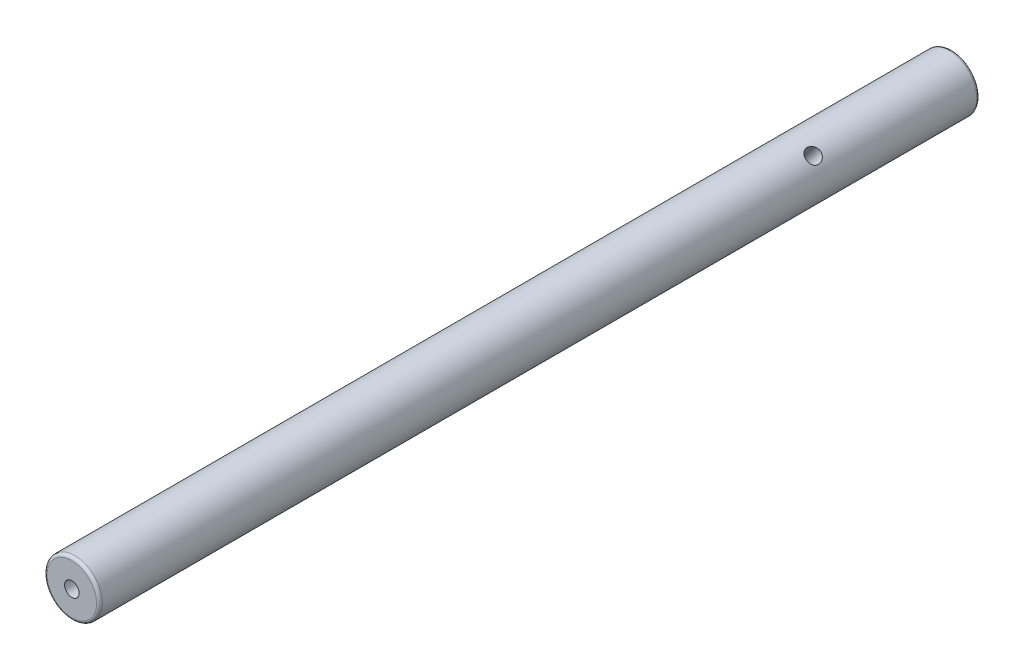
ISO-10303-21;
HEADER;
FILE_DESCRIPTION(('STEP AP214'),'2;1');
FILE_NAME('part.step','',(''),(''),'','','');
FILE_SCHEMA(('AUTOMOTIVE_DESIGN { 1 0 10303 214 1 1 1 1 }'));
ENDSEC;
DATA;
#1=APPLICATION_CONTEXT('core data for automotive mechanical design processes');
#2=APPLICATION_PROTOCOL_DEFINITION('international standard','automotive_design',2000,#1);
#3=PRODUCT_CONTEXT('',#1,'mechanical');
#4=PRODUCT('Part','Part','',(#3));
#5=PRODUCT_RELATED_PRODUCT_CATEGORY('part','',(#4));
#6=PRODUCT_DEFINITION_FORMATION('','',#4);
#7=PRODUCT_DEFINITION_CONTEXT('part definition',#1,'design');
#8=PRODUCT_DEFINITION('design','',#6,#7);
#9=PRODUCT_DEFINITION_SHAPE('','',#8);
#10=(LENGTH_UNIT() NAMED_UNIT(*) SI_UNIT(.MILLI.,.METRE.));
#11=(NAMED_UNIT(*) PLANE_ANGLE_UNIT() SI_UNIT($,.RADIAN.));
#12=(NAMED_UNIT(*) SI_UNIT($,.STERADIAN.) SOLID_ANGLE_UNIT());
#13=UNCERTAINTY_MEASURE_WITH_UNIT(LENGTH_MEASURE(1.E-05),#10,'distance_accuracy_value','');
#14=(GEOMETRIC_REPRESENTATION_CONTEXT(3) GLOBAL_UNCERTAINTY_ASSIGNED_CONTEXT((#13)) GLOBAL_UNIT_ASSIGNED_CONTEXT((#10,
#11,#12)) REPRESENTATION_CONTEXT('',''));
#15=CARTESIAN_POINT('',(0.,0.,0.));
#16=DIRECTION('',(0.,0.,1.));
#17=DIRECTION('',(1.,0.,0.));
#18=AXIS2_PLACEMENT_3D('',#15,#16,#17);
#19=CARTESIAN_POINT('',(21.8999999999962,0.462441067612375,151.9));
#20=DIRECTION('',(0.,0.,-1.));
#21=DIRECTION('',(-1.,0.,0.));
#22=AXIS2_PLACEMENT_3D('',#19,#20,#21);
#23=CYLINDRICAL_SURFACE('',#22,4.7625);
#24=CARTESIAN_POINT('',(25.7124541433058,3.31666594578188,26.8798431194875));
#25=CARTESIAN_POINT('',(25.7124535272983,3.31666798785655,26.94874580982));
#26=CARTESIAN_POINT('',(25.708910866298,3.32141755071829,27.0176671441755));
#27=CARTESIAN_POINT('',(25.6947768974908,3.34014981082393,27.1535222598803));
#28=CARTESIAN_POINT('',(25.6841819087729,3.35413732972188,27.2204549842211));
#29=CARTESIAN_POINT('',(25.6560757708168,3.39055057007776,27.3503480035381));
#30=CARTESIAN_POINT('',(25.6385741392799,3.41296467726956,27.4133136274866));
#31=CARTESIAN_POINT('',(25.5968268334932,3.46510461897121,27.5337321681667));
#32=CARTESIAN_POINT('',(25.572580695732,3.4948309559927,27.5911847056501));
#33=CARTESIAN_POINT('',(25.5169691128551,3.56096377468271,27.7003386629329));
#34=CARTESIAN_POINT('',(25.4854594729519,3.59750221513439,27.7518867003807));
#35=CARTESIAN_POINT('',(25.4159756893275,3.67523338687913,27.8464136824974));
#36=CARTESIAN_POINT('',(25.3780008935229,3.71642658751589,27.8893917618396));
#37=CARTESIAN_POINT('',(25.2954611694897,3.80247897286531,27.9661953306249));
#38=CARTESIAN_POINT('',(25.2508033049293,3.84738504513893,27.999868798466));
#39=CARTESIAN_POINT('',(25.1561620887646,3.93851984837433,28.0561166165339));
#40=CARTESIAN_POINT('',(25.106179607688,3.98474836222733,28.0786927776945));
#41=CARTESIAN_POINT('',(25.003207569433,4.07576695442622,28.1116100342251));
#42=CARTESIAN_POINT('',(24.9503095464915,4.12056616585416,28.1222119305464));
#43=CARTESIAN_POINT('',(24.8419535485365,4.20826140413346,28.1316997494407));
#44=CARTESIAN_POINT('',(24.7864959905602,4.25115773881141,28.13058757398));
#45=CARTESIAN_POINT('',(24.6760690551143,4.33277034128328,28.1168634864203));
#46=CARTESIAN_POINT('',(24.6211208694524,4.37156314489715,28.1045332786113));
#47=CARTESIAN_POINT('',(24.5120685533531,4.44525890274682,28.0691776470344));
#48=CARTESIAN_POINT('',(24.4579644704458,4.48016163861325,28.0461516232302));
#49=CARTESIAN_POINT('',(24.3517948135382,4.54582766511779,27.9898389994143));
#50=CARTESIAN_POINT('',(24.2997541402059,4.57654746225011,27.9564549224328));
#51=CARTESIAN_POINT('',(24.199965131989,4.63315596043104,27.8804484308006));
#52=CARTESIAN_POINT('',(24.1522176133969,4.65904374373213,27.8378242644898));
#53=CARTESIAN_POINT('',(24.0612930590823,4.70660559786781,27.7430482934367));
#54=CARTESIAN_POINT('',(24.0182943661324,4.72813131198919,27.6906506614635));
#55=CARTESIAN_POINT('',(23.9402004495182,4.76603001520334,27.5785949783498));
#56=CARTESIAN_POINT('',(23.9051056771934,4.78240271006315,27.5189365128914));
#57=CARTESIAN_POINT('',(23.8441179851303,4.8101929393802,27.3935622725705));
#58=CARTESIAN_POINT('',(23.8182797296543,4.82158112266232,27.3278133091797));
#59=CARTESIAN_POINT('',(23.7773248060559,4.83937628818703,27.1924195662091));
#60=CARTESIAN_POINT('',(23.7622055742686,4.84578446153196,27.1227757224683));
#61=CARTESIAN_POINT('',(23.7437349639611,4.85358510979823,26.9837329744681));
#62=CARTESIAN_POINT('',(23.7400551283647,4.85511761002267,26.9143855042066));
#63=CARTESIAN_POINT('',(23.7437203953273,4.85358049070761,26.776039013052));
#64=CARTESIAN_POINT('',(23.7510643660073,4.85051134364634,26.7070399571151));
#65=CARTESIAN_POINT('',(23.7761661216236,4.8398358742136,26.5726660700373));
#66=CARTESIAN_POINT('',(23.793729112454,4.83231437681688,26.5072478433386));
#67=CARTESIAN_POINT('',(23.8383043164007,4.81272514259196,26.3804379213682));
#68=CARTESIAN_POINT('',(23.8653177346665,4.80065682592336,26.3190467408249));
#69=CARTESIAN_POINT('',(23.9283319554895,4.77155943601696,26.2005850317341));
#70=CARTESIAN_POINT('',(23.9645125506496,4.75442982380094,26.1436349322845));
#71=CARTESIAN_POINT('',(24.0441344955256,4.71521181886717,26.0369712324296));
#72=CARTESIAN_POINT('',(24.0875771657368,4.69312252405719,25.9872589511903));
#73=CARTESIAN_POINT('',(24.1814567241391,4.64326143441037,25.8950584327975));
#74=CARTESIAN_POINT('',(24.2320548958971,4.61534833023177,25.8528103579077));
#75=CARTESIAN_POINT('',(24.3374569663955,4.55437350003571,25.7784937379168));
#76=CARTESIAN_POINT('',(24.3922606415829,4.52131204759419,25.7464246521937));
#77=CARTESIAN_POINT('',(24.5037394421809,4.45070674988439,25.6936671099683));
#78=CARTESIAN_POINT('',(24.5603972545268,4.41319874136743,25.6728943169606));
#79=CARTESIAN_POINT('',(24.6740479026418,4.33424249153487,25.6430719479461));
#80=CARTESIAN_POINT('',(24.7310406640285,4.29279509616736,25.6340198611004));
#81=CARTESIAN_POINT('',(24.8418310525246,4.20833818450626,25.6280490558711));
#82=CARTESIAN_POINT('',(24.8956732949589,4.16541177872656,25.6307775142029));
#83=CARTESIAN_POINT('',(25.0004065231144,4.07817487654275,25.6474739839419));
#84=CARTESIAN_POINT('',(25.051297613458,4.03386442929063,25.6614415966441));
#85=CARTESIAN_POINT('',(25.1485586502269,3.94562364315392,25.7000229398875));
#86=CARTESIAN_POINT('',(25.1949557641974,3.90169270215624,25.7245670761355));
#87=CARTESIAN_POINT('',(25.2826862741768,3.81544397846261,25.7835424250831));
#88=CARTESIAN_POINT('',(25.3240189764592,3.77312641731418,25.8179749901511));
#89=CARTESIAN_POINT('',(25.4019751945893,3.69058069191565,25.896793579498));
#90=CARTESIAN_POINT('',(25.4384484669608,3.65043537342234,25.9414149550714));
#91=CARTESIAN_POINT('',(25.5049271321938,3.57506657672825,26.038895442105));
#92=CARTESIAN_POINT('',(25.5349308375471,3.53984438350582,26.0917566966579));
#93=CARTESIAN_POINT('',(25.5887112616762,3.47518490604891,26.2055595436875));
#94=CARTESIAN_POINT('',(25.6123431144779,3.44588547976424,26.2666481895083));
#95=CARTESIAN_POINT('',(25.6522712644119,3.39551228450543,26.3943380305614));
#96=CARTESIAN_POINT('',(25.6685725012413,3.37443297772305,26.4609354777826));
#97=CARTESIAN_POINT('',(25.6915422734076,3.34443767789222,26.5860752772738));
#98=CARTESIAN_POINT('',(25.6993779071091,3.33406232580211,26.6440600264723));
#99=CARTESIAN_POINT('',(25.7098338305192,3.32017594530608,26.7613063816732));
#100=CARTESIAN_POINT('',(25.7124546732417,3.31666418903591,26.8205678516092));
#101=CARTESIAN_POINT('',(25.7124541433058,3.31666594578188,26.8798431194875));
#102=B_SPLINE_CURVE_WITH_KNOTS('',3,(#24,#25,#26,#27,#28,#29,#30,#31,#32,#33,#34,#35,#36,#37,
#38,#39,#40,#41,#42,#43,#44,#45,#46,#47,#48,#49,#50,#51,#52,#53,#54,#55,#56,#57,#58,#59,#60,#61,
#62,#63,#64,#65,#66,#67,#68,#69,#70,#71,#72,#73,#74,#75,#76,#77,#78,#79,#80,#81,#82,#83,#84,#85,
#86,#87,#88,#89,#90,#91,#92,#93,#94,#95,#96,#97,#98,#99,#100,#101),.UNSPECIFIED.,.T.,.F.,(4,2,2,
2,2,2,2,2,2,2,2,2,2,2,2,2,2,2,2,2,2,2,2,2,2,2,2,2,2,2,2,2,2,2,2,2,2,2,4),(0.,0.206490182150449,
0.413088224944715,0.619402553891777,0.825731065151443,1.03657512737686,1.2474404682038,
1.46157082227235,1.67566622148603,1.88500281437052,2.09430541864819,2.29849291347871,
2.50269186462939,2.70887395720547,2.91509517032053,3.12745456303139,3.33982607908097,
3.55343184571552,3.76698650709076,3.97434995380706,4.18169211075558,4.38520571315102,
4.58874527773326,4.79663626558293,5.00456509637523,5.21829337157569,5.4320102934316,
5.64410892981004,5.85616212236811,6.06190916051431,6.26764890017794,6.47205504834508,
6.67648916497753,6.88623450605488,7.09603449065951,7.31026457561842,7.52435008565062,
7.70200728598687,7.8796456452748),.UNSPECIFIED.);
#103=CARTESIAN_POINT('',(25.7124541433058,3.31666594578188,26.8798431194875));
#104=VERTEX_POINT('',#103);
#105=EDGE_CURVE('E37',#104,#104,#102,.T.);
#106=ORIENTED_EDGE('',*,*,#105,.T.);
#107=EDGE_LOOP('',(#106));
#108=FACE_BOUND('',#107,.T.);
#109=CARTESIAN_POINT('',(20.0585707928625,-3.92965919594206,26.8798431194875));
#110=CARTESIAN_POINT('',(20.0585686622877,-3.92965909501938,26.810940429155));
#111=CARTESIAN_POINT('',(20.0531001700474,-3.92737778246779,26.7420190947994));
#112=CARTESIAN_POINT('',(20.0314931263372,-3.91822342257674,26.6061639790946));
#113=CARTESIAN_POINT('',(20.0153490028284,-3.91134797735601,26.5392312547538));
#114=CARTESIAN_POINT('',(19.973193983464,-3.89294054933338,26.4093382354368));
#115=CARTESIAN_POINT('',(19.9471966677464,-3.88141497415735,26.3463726114883));
#116=CARTESIAN_POINT('',(19.8864697792926,-3.85360030033533,26.2259540708082));
#117=CARTESIAN_POINT('',(19.8517396064127,-3.83731087429307,26.1685015333249));
#118=CARTESIAN_POINT('',(19.7740683697756,-3.7994509105158,26.059347576042));
#119=CARTESIAN_POINT('',(19.7309642431299,-3.77777259638438,26.0077995385942));
#120=CARTESIAN_POINT('',(19.6386693742325,-3.72927735514589,25.9132725564775));
#121=CARTESIAN_POINT('',(19.5894780181522,-3.70245990966546,25.8702944771353));
#122=CARTESIAN_POINT('',(19.4859367787681,-3.64332421135551,25.7934909083501));
#123=CARTESIAN_POINT('',(19.4315188151087,-3.61092721419081,25.7598174405089));
#124=CARTESIAN_POINT('',(19.3201048789417,-3.54128924332952,25.703569622441));
#125=CARTESIAN_POINT('',(19.263109328721,-3.50404906123185,25.6809934612804));
#126=CARTESIAN_POINT('',(19.1497822209436,-3.42630209067304,25.6480762047498));
#127=CARTESIAN_POINT('',(19.0934640638189,-3.38588630967399,25.6374743084285));
#128=CARTESIAN_POINT('',(18.9820512718956,-3.30210882519554,25.6279864895342));
#129=CARTESIAN_POINT('',(18.9269564399264,-3.25874760109164,25.6290986649949));
#130=CARTESIAN_POINT('',(18.8209400776059,-3.17148216764563,25.6428227525546));
#131=CARTESIAN_POINT('',(18.7699494623967,-3.12761712597982,25.6551529603636));
#132=CARTESIAN_POINT('',(18.6719465699381,-3.03975982439695,25.6905085919406));
#133=CARTESIAN_POINT('',(18.6249345160613,-2.99576755748018,25.7135346157447));
#134=CARTESIAN_POINT('',(18.5354213174427,-2.90875370595159,25.7698472395607));
#135=CARTESIAN_POINT('',(18.4929684159354,-2.86574569773975,25.8032313165422));
#136=CARTESIAN_POINT('',(18.4137924978336,-2.78271833947799,25.8792378081743));
#137=CARTESIAN_POINT('',(18.3770705699431,-2.74269955803784,25.9218619744852));
#138=CARTESIAN_POINT('',(18.3088253879955,-2.66607058383689,26.0166379455382));
#139=CARTESIAN_POINT('',(18.2774894066348,-2.62959730271231,26.0690355775114));
#140=CARTESIAN_POINT('',(18.2217374596787,-2.56306391313938,26.1810912606252));
#141=CARTESIAN_POINT('',(18.1973218892407,-2.5330041709301,26.2407497260835));
#142=CARTESIAN_POINT('',(18.1555348717884,-2.48060531024475,26.3661239664044));
#143=CARTESIAN_POINT('',(18.138205188144,-2.45831207743089,26.4318729297952));
#144=CARTESIAN_POINT('',(18.1109847731784,-2.42291401686108,26.5672666727659));
#145=CARTESIAN_POINT('',(18.101092263077,-2.40980699205187,26.6369105165067));
#146=CARTESIAN_POINT('',(18.0890340885527,-2.39378781649104,26.7759532645068));
#147=CARTESIAN_POINT('',(18.0866527278606,-2.39059112003867,26.8453007347684));
#148=CARTESIAN_POINT('',(18.0890350261742,-2.39377256191944,26.9836472259229));
#149=CARTESIAN_POINT('',(18.0937979516341,-2.40014971724895,27.0526462818598));
#150=CARTESIAN_POINT('',(18.1102572139015,-2.42190187733108,27.1870201689376));
#151=CARTESIAN_POINT('',(18.1218239019496,-2.43710856328157,27.2524383956363));
#152=CARTESIAN_POINT('',(18.1516649113885,-2.47558194447004,27.3792483176067));
#153=CARTESIAN_POINT('',(18.1699400882826,-2.4988496676742,27.44063949815));
#154=CARTESIAN_POINT('',(18.2134878391463,-2.55289634675825,27.5591012072408));
#155=CARTESIAN_POINT('',(18.2389016560868,-2.58382524892633,27.6160513066904));
#156=CARTESIAN_POINT('',(18.2963048874823,-2.65151996838192,27.7227150065453));
#157=CARTESIAN_POINT('',(18.3282954980685,-2.68828684715356,27.7724272877846));
#158=CARTESIAN_POINT('',(18.3994894944513,-2.76722298986164,27.8646278061774));
#159=CARTESIAN_POINT('',(18.43886916866,-2.80951433211215,27.9068758810672));
#160=CARTESIAN_POINT('',(18.5236453337246,-2.89692444720029,27.9811925010581));
#161=CARTESIAN_POINT('',(18.5690415048533,-2.94204306972417,28.0132615867812));
#162=CARTESIAN_POINT('',(18.6646367834851,-3.03300555512756,28.0660191290067));
#163=CARTESIAN_POINT('',(18.7147969198181,-3.07884133946453,28.0867919220143));
#164=CARTESIAN_POINT('',(18.8190206147599,-3.16987968642484,28.1166142910288));
#165=CARTESIAN_POINT('',(18.8730833347267,-3.21508238261681,28.1256663778746));
#166=CARTESIAN_POINT('',(18.9819470077395,-3.30200867788243,28.1316371831038));
#167=CARTESIAN_POINT('',(19.0366781947436,-3.34379576383772,28.128908724772));
#168=CARTESIAN_POINT('',(19.1467654221013,-3.42417068875329,28.112212255033));
#169=CARTESIAN_POINT('',(19.2021214402205,-3.46275864114815,28.0982446423309));
#170=CARTESIAN_POINT('',(19.3113653241706,-3.53564155705388,28.0596632990874));
#171=CARTESIAN_POINT('',(19.3652603806589,-3.56996272614599,28.0351191628394));
#172=CARTESIAN_POINT('',(19.4702543628279,-3.63408564270719,27.9761438138918));
#173=CARTESIAN_POINT('',(19.5213529049109,-3.66388677115073,27.9417112488238));
#174=CARTESIAN_POINT('',(19.6203781310434,-3.71942930724794,27.8628926594769));
#175=CARTESIAN_POINT('',(19.6681879199851,-3.74504512805807,27.8182712839035));
#176=CARTESIAN_POINT('',(19.7574605434662,-3.79119994517485,27.7207907968699));
#177=CARTESIAN_POINT('',(19.7989217212318,-3.81173761711234,27.667929542317));
#178=CARTESIAN_POINT('',(19.8747185425768,-3.84817967960205,27.5541266952874));
#179=CARTESIAN_POINT('',(19.9088852379683,-3.86397707728236,27.4930380494666));
#180=CARTESIAN_POINT('',(19.9674560325119,-3.89045684284523,27.3653482084136));
#181=CARTESIAN_POINT('',(19.9918667044713,-3.90114265545288,27.2987507611923));
#182=CARTESIAN_POINT('',(20.0265473788551,-3.9161286245439,27.1736109617011));
#183=CARTESIAN_POINT('',(20.0385167475249,-3.92120595653469,27.1156262125026));
#184=CARTESIAN_POINT('',(20.0545289507204,-3.92797110593914,26.9983798573017));
#185=CARTESIAN_POINT('',(20.0585726257429,-3.92965928276332,26.9391183873657));
#186=CARTESIAN_POINT('',(20.0585707928625,-3.92965919594206,26.8798431194875));
#187=B_SPLINE_CURVE_WITH_KNOTS('',3,(#109,#110,#111,#112,#113,#114,#115,#116,#117,#118,#119,
#120,#121,#122,#123,#124,#125,#126,#127,#128,#129,#130,#131,#132,#133,#134,#135,#136,#137,#138,
#139,#140,#141,#142,#143,#144,#145,#146,#147,#148,#149,#150,#151,#152,#153,#154,#155,#156,#157,
#158,#159,#160,#161,#162,#163,#164,#165,#166,#167,#168,#169,#170,#171,#172,#173,#174,#175,#176,
#177,#178,#179,#180,#181,#182,#183,#184,#185,#186),.UNSPECIFIED.,.T.,.F.,(4,2,2,2,2,2,2,2,2,2,2,
2,2,2,2,2,2,2,2,2,2,2,2,2,2,2,2,2,2,2,2,2,2,2,2,2,2,2,4),(0.,0.206490182150453,
0.413088224944715,0.619402553891785,0.825731065151439,1.03657512737686,1.2474404682038,
1.46157082227236,1.67566622148603,1.88500281437052,2.0943054186482,2.29849291347871,
2.50269186462939,2.70887395720547,2.91509517032054,3.12745456303139,3.33982607908097,
3.55343184571553,3.76698650709076,3.97434995380706,4.18169211075558,4.38520571315102,
4.58874527773325,4.79663626558293,5.00456509637523,5.21829337157569,5.4320102934316,
5.64410892981004,5.85616212236811,6.06190916051431,6.26764890017795,6.47205504834509,
6.67648916497753,6.88623450605489,7.09603449065951,7.31026457561841,7.52435008565062,
7.70200728598688,7.8796456452748),.UNSPECIFIED.);
#188=CARTESIAN_POINT('',(20.0585707928625,-3.92965919594206,26.8798431194875));
#189=VERTEX_POINT('',#188);
#190=EDGE_CURVE('E11',#189,#189,#187,.T.);
#191=ORIENTED_EDGE('',*,*,#190,.T.);
#192=EDGE_LOOP('',(#191));
#193=FACE_BOUND('',#192,.T.);
#194=CARTESIAN_POINT('',(21.8999999999962,0.462441067612375,151.4));
#195=DIRECTION('',(0.,0.,1.));
#196=DIRECTION('',(1.,0.,0.));
#197=AXIS2_PLACEMENT_3D('',#194,#195,#196);
#198=CIRCLE('',#197,4.7625);
#199=CARTESIAN_POINT('',(26.6624999999962,0.462441067612375,151.4));
#200=VERTEX_POINT('',#199);
#201=EDGE_CURVE('E46',#200,#200,#198,.F.);
#202=ORIENTED_EDGE('',*,*,#201,.T.);
#203=EDGE_LOOP('',(#202));
#204=FACE_BOUND('',#203,.T.);
#205=CARTESIAN_POINT('',(21.8999999999962,0.462441067612375,0.5));
#206=DIRECTION('',(0.,0.,1.));
#207=DIRECTION('',(1.,0.,0.));
#208=AXIS2_PLACEMENT_3D('',#205,#206,#207);
#209=CIRCLE('',#208,4.7625);
#210=CARTESIAN_POINT('',(26.6624999999962,0.462441067612375,0.5));
#211=VERTEX_POINT('',#210);
#212=EDGE_CURVE('E73',#211,#211,#209,.T.);
#213=ORIENTED_EDGE('',*,*,#212,.T.);
#214=EDGE_LOOP('',(#213));
#215=FACE_BOUND('',#214,.T.);
#216=ADVANCED_FACE('F33',(#108,#193,#204,#215),#23,.T.);
#217=CARTESIAN_POINT('',(21.8999999999962,0.462441067612375,151.9));
#218=DIRECTION('',(0.,0.,1.));
#219=DIRECTION('',(1.,0.,0.));
#220=AXIS2_PLACEMENT_3D('',#217,#218,#219);
#221=PLANE('',#220);
#222=CARTESIAN_POINT('',(21.8999999999962,0.462441067612375,151.9));
#223=DIRECTION('',(0.,0.,1.));
#224=DIRECTION('',(1.,0.,0.));
#225=AXIS2_PLACEMENT_3D('',#222,#223,#224);
#226=CIRCLE('',#225,4.2625);
#227=CARTESIAN_POINT('',(26.1624999999962,0.462441067612375,151.9));
#228=VERTEX_POINT('',#227);
#229=EDGE_CURVE('E79',#228,#228,#226,.T.);
#230=ORIENTED_EDGE('',*,*,#229,.T.);
#231=EDGE_LOOP('',(#230));
#232=FACE_BOUND('',#231,.T.);
#233=CARTESIAN_POINT('',(21.8999999999962,0.462441067612375,151.9));
#234=DIRECTION('',(0.,0.,1.));
#235=DIRECTION('',(1.,0.,0.));
#236=AXIS2_PLACEMENT_3D('',#233,#234,#235);
#237=CIRCLE('',#236,1.24999999999999);
#238=CARTESIAN_POINT('',(23.1499999999962,0.462441067612375,151.9));
#239=VERTEX_POINT('',#238);
#240=EDGE_CURVE('E63',#239,#239,#237,.T.);
#241=ORIENTED_EDGE('',*,*,#240,.F.);
#242=EDGE_LOOP('',(#241));
#243=FACE_BOUND('',#242,.T.);
#244=ADVANCED_FACE('F103',(#232,#243),#221,.T.);
#245=CARTESIAN_POINT('',(21.8999999999962,0.462441067612375,0.));
#246=DIRECTION('',(0.,0.,1.));
#247=DIRECTION('',(1.,0.,0.));
#248=AXIS2_PLACEMENT_3D('',#245,#246,#247);
#249=PLANE('',#248);
#250=CARTESIAN_POINT('',(21.8999999999962,0.462441067612375,0.));
#251=DIRECTION('',(0.,0.,1.));
#252=DIRECTION('',(1.,0.,0.));
#253=AXIS2_PLACEMENT_3D('',#250,#251,#252);
#254=CIRCLE('',#253,4.2625);
#255=CARTESIAN_POINT('',(26.1624999999962,0.462441067612375,0.));
#256=VERTEX_POINT('',#255);
#257=EDGE_CURVE('E76',#256,#256,#254,.F.);
#258=ORIENTED_EDGE('',*,*,#257,.T.);
#259=EDGE_LOOP('',(#258));
#260=FACE_BOUND('',#259,.T.);
#261=CARTESIAN_POINT('',(21.8999999999962,0.462441067612375,0.));
#262=DIRECTION('',(0.,0.,-1.));
#263=DIRECTION('',(-1.,0.,0.));
#264=AXIS2_PLACEMENT_3D('',#261,#262,#263);
#265=CIRCLE('',#264,2.1);
#266=CARTESIAN_POINT('',(19.7999999999962,0.462441067612375,0.));
#267=VERTEX_POINT('',#266);
#268=EDGE_CURVE('E62',#267,#267,#265,.T.);
#269=ORIENTED_EDGE('',*,*,#268,.F.);
#270=EDGE_LOOP('',(#269));
#271=FACE_BOUND('',#270,.T.);
#272=ADVANCED_FACE('F102',(#260,#271),#249,.F.);
#273=CARTESIAN_POINT('',(21.8999999999962,0.462441067612375,14.));
#274=DIRECTION('',(0.,0.,-1.));
#275=DIRECTION('',(-1.,0.,0.));
#276=AXIS2_PLACEMENT_3D('',#273,#274,#275);
#277=CONICAL_SURFACE('',#276,2.1,1.02974425867665);
#278=CARTESIAN_POINT('',(21.8999999999962,0.462441067612375,15.2618072999579));
#279=VERTEX_POINT('',#278);
#280=VERTEX_LOOP('',#279);
#281=FACE_BOUND('',#280,.T.);
#282=CARTESIAN_POINT('',(21.8999999999962,0.462441067612375,14.));
#283=DIRECTION('',(0.,0.,-1.));
#284=DIRECTION('',(-1.,0.,0.));
#285=AXIS2_PLACEMENT_3D('',#282,#283,#284);
#286=CIRCLE('',#285,2.1);
#287=CARTESIAN_POINT('',(19.7999999999962,0.462441067612375,14.));
#288=VERTEX_POINT('',#287);
#289=EDGE_CURVE('E66',#288,#288,#286,.T.);
#290=ORIENTED_EDGE('',*,*,#289,.T.);
#291=EDGE_LOOP('',(#290));
#292=FACE_BOUND('',#291,.T.);
#293=ADVANCED_FACE('F98',(#281,#292),#277,.F.);
#294=CARTESIAN_POINT('',(21.8999999999962,0.462441067612375,0.));
#295=DIRECTION('',(0.,0.,-1.));
#296=DIRECTION('',(-1.,0.,0.));
#297=AXIS2_PLACEMENT_3D('',#294,#295,#296);
#298=CYLINDRICAL_SURFACE('',#297,2.1);
#299=ORIENTED_EDGE('',*,*,#289,.F.);
#300=EDGE_LOOP('',(#299));
#301=FACE_BOUND('',#300,.T.);
#302=ORIENTED_EDGE('',*,*,#268,.T.);
#303=EDGE_LOOP('',(#302));
#304=FACE_BOUND('',#303,.T.);
#305=ADVANCED_FACE('F95',(#301,#304),#298,.F.);
#306=CARTESIAN_POINT('',(21.8999999999962,0.462441067612375,0.5));
#307=DIRECTION('',(0.,0.,1.));
#308=DIRECTION('',(1.,0.,0.));
#309=AXIS2_PLACEMENT_3D('',#306,#307,#308);
#310=TOROIDAL_SURFACE('',#309,4.2625,0.5);
#311=ORIENTED_EDGE('',*,*,#257,.F.);
#312=EDGE_LOOP('',(#311));
#313=FACE_BOUND('',#312,.T.);
#314=ORIENTED_EDGE('',*,*,#212,.F.);
#315=EDGE_LOOP('',(#314));
#316=FACE_BOUND('',#315,.T.);
#317=ADVANCED_FACE('F56',(#313,#316),#310,.T.);
#318=CARTESIAN_POINT('',(21.8999999999962,0.462441067612375,146.9));
#319=DIRECTION('',(0.,0.,1.));
#320=DIRECTION('',(1.,0.,0.));
#321=AXIS2_PLACEMENT_3D('',#318,#319,#320);
#322=CONICAL_SURFACE('',#321,1.25,1.02974425867666);
#323=CARTESIAN_POINT('',(21.8999999999962,0.462441067612375,146.148924226216));
#324=VERTEX_POINT('',#323);
#325=VERTEX_LOOP('',#324);
#326=FACE_BOUND('',#325,.T.);
#327=CARTESIAN_POINT('',(21.8999999999962,0.462441067612375,146.9));
#328=DIRECTION('',(0.,0.,1.));
#329=DIRECTION('',(1.,0.,0.));
#330=AXIS2_PLACEMENT_3D('',#327,#328,#329);
#331=CIRCLE('',#330,1.25);
#332=CARTESIAN_POINT('',(23.1499999999962,0.462441067612375,146.9));
#333=VERTEX_POINT('',#332);
#334=EDGE_CURVE('E60',#333,#333,#331,.T.);
#335=ORIENTED_EDGE('',*,*,#334,.T.);
#336=EDGE_LOOP('',(#335));
#337=FACE_BOUND('',#336,.T.);
#338=ADVANCED_FACE('F52',(#326,#337),#322,.F.);
#339=CARTESIAN_POINT('',(21.8999999999962,0.462441067612375,151.9));
#340=DIRECTION('',(0.,0.,1.));
#341=DIRECTION('',(1.,0.,0.));
#342=AXIS2_PLACEMENT_3D('',#339,#340,#341);
#343=CYLINDRICAL_SURFACE('',#342,1.24999999999999);
#344=ORIENTED_EDGE('',*,*,#334,.F.);
#345=EDGE_LOOP('',(#344));
#346=FACE_BOUND('',#345,.T.);
#347=ORIENTED_EDGE('',*,*,#240,.T.);
#348=EDGE_LOOP('',(#347));
#349=FACE_BOUND('',#348,.T.);
#350=ADVANCED_FACE('F55',(#346,#349),#343,.F.);
#351=CARTESIAN_POINT('',(21.8999999999962,0.462441067612375,151.4));
#352=DIRECTION('',(0.,0.,1.));
#353=DIRECTION('',(1.,0.,0.));
#354=AXIS2_PLACEMENT_3D('',#351,#352,#353);
#355=TOROIDAL_SURFACE('',#354,4.2625,0.5);
#356=ORIENTED_EDGE('',*,*,#201,.F.);
#357=EDGE_LOOP('',(#356));
#358=FACE_BOUND('',#357,.T.);
#359=ORIENTED_EDGE('',*,*,#229,.F.);
#360=EDGE_LOOP('',(#359));
#361=FACE_BOUND('',#360,.T.);
#362=ADVANCED_FACE('F35',(#358,#361),#355,.T.);
#363=CARTESIAN_POINT('',(18.9703473908379,-3.29236143580266,26.8798431194875));
#364=DIRECTION('',(-0.615150154153978,-0.788409974470349,0.));
#365=DIRECTION('',(0.788409974470349,-0.615150154153978,0.));
#366=AXIS2_PLACEMENT_3D('',#363,#364,#365);
#367=CYLINDRICAL_SURFACE('',#366,1.24999999999999);
#368=ORIENTED_EDGE('',*,*,#190,.F.);
#369=EDGE_LOOP('',(#368));
#370=FACE_BOUND('',#369,.T.);
#371=ORIENTED_EDGE('',*,*,#105,.F.);
#372=EDGE_LOOP('',(#371));
#373=FACE_BOUND('',#372,.T.);
#374=ADVANCED_FACE('F87',(#370,#373),#367,.F.);
#375=CLOSED_SHELL('',(#216,#244,#272,#293,#305,#317,#338,#350,#362,#374));
#376=MANIFOLD_SOLID_BREP('B2',#375);
#377=ADVANCED_BREP_SHAPE_REPRESENTATION('',(#18,#376),#14);
#378=SHAPE_DEFINITION_REPRESENTATION(#9,#377);
ENDSEC;
END-ISO-10303-21;
